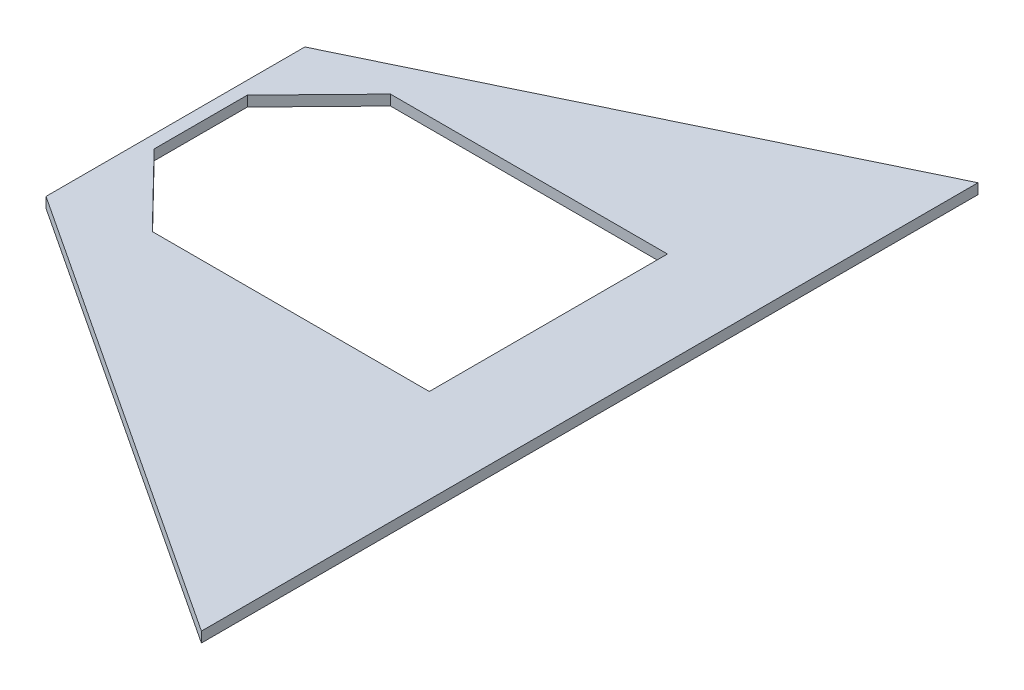
ISO-10303-21;
HEADER;
FILE_DESCRIPTION(('STEP AP214'),'2;1');
FILE_NAME('part.step','',(''),(''),'','','');
FILE_SCHEMA(('AUTOMOTIVE_DESIGN { 1 0 10303 214 1 1 1 1 }'));
ENDSEC;
DATA;
#1=APPLICATION_CONTEXT('core data for automotive mechanical design processes');
#2=APPLICATION_PROTOCOL_DEFINITION('international standard','automotive_design',2000,#1);
#3=PRODUCT_CONTEXT('',#1,'mechanical');
#4=PRODUCT('Part','Part','',(#3));
#5=PRODUCT_RELATED_PRODUCT_CATEGORY('part','',(#4));
#6=PRODUCT_DEFINITION_FORMATION('','',#4);
#7=PRODUCT_DEFINITION_CONTEXT('part definition',#1,'design');
#8=PRODUCT_DEFINITION('design','',#6,#7);
#9=PRODUCT_DEFINITION_SHAPE('','',#8);
#10=(LENGTH_UNIT() NAMED_UNIT(*) SI_UNIT(.MILLI.,.METRE.));
#11=(NAMED_UNIT(*) PLANE_ANGLE_UNIT() SI_UNIT($,.RADIAN.));
#12=(NAMED_UNIT(*) SI_UNIT($,.STERADIAN.) SOLID_ANGLE_UNIT());
#13=UNCERTAINTY_MEASURE_WITH_UNIT(LENGTH_MEASURE(1.E-05),#10,'distance_accuracy_value','');
#14=(GEOMETRIC_REPRESENTATION_CONTEXT(3) GLOBAL_UNCERTAINTY_ASSIGNED_CONTEXT((#13)) GLOBAL_UNIT_ASSIGNED_CONTEXT((#10,
#11,#12)) REPRESENTATION_CONTEXT('',''));
#15=CARTESIAN_POINT('',(0.,0.,0.));
#16=DIRECTION('',(0.,0.,1.));
#17=DIRECTION('',(1.,0.,0.));
#18=AXIS2_PLACEMENT_3D('',#15,#16,#17);
#19=CARTESIAN_POINT('',(0.,14.,0.));
#20=DIRECTION('',(0.,-1.,0.));
#21=DIRECTION('',(0.,0.,-1.));
#22=AXIS2_PLACEMENT_3D('',#19,#20,#21);
#23=PLANE('',#22);
#24=DIRECTION('',(0.698119237155006,0.,0.715981515623212));
#25=VECTOR('',#24,1.);
#26=CARTESIAN_POINT('',(-160.925569150778,14.,14.8388294913458));
#27=LINE('',#26,#25);
#28=CARTESIAN_POINT('',(-160.925569150778,14.,14.8388294913458));
#29=VERTEX_POINT('',#28);
#30=CARTESIAN_POINT('',(-133.624112040778,14.,42.8388294913458));
#31=VERTEX_POINT('',#30);
#32=EDGE_CURVE('E112',#29,#31,#27,.T.);
#33=ORIENTED_EDGE('',*,*,#32,.F.);
#34=DIRECTION('',(0.,0.,1.));
#35=VECTOR('',#34,1.);
#36=CARTESIAN_POINT('',(-160.925569150778,14.,-21.1611705086542));
#37=LINE('',#36,#35);
#38=CARTESIAN_POINT('',(-160.925569150778,14.,-21.1611705086542));
#39=VERTEX_POINT('',#38);
#40=EDGE_CURVE('E182',#39,#29,#37,.T.);
#41=ORIENTED_EDGE('',*,*,#40,.F.);
#42=DIRECTION('',(-0.698119237155006,0.,0.715981515623212));
#43=VECTOR('',#42,1.);
#44=CARTESIAN_POINT('',(-160.925569150778,14.,-21.1611705086542));
#45=LINE('',#44,#43);
#46=CARTESIAN_POINT('',(-133.624112040778,14.,-49.1611705086542));
#47=VERTEX_POINT('',#46);
#48=EDGE_CURVE('E168',#47,#39,#45,.T.);
#49=ORIENTED_EDGE('',*,*,#48,.F.);
#50=DIRECTION('',(-1.,0.,0.));
#51=VECTOR('',#50,1.);
#52=CARTESIAN_POINT('',(-133.624112040778,14.,-49.1611705086542));
#53=LINE('',#52,#51);
#54=CARTESIAN_POINT('',(-26.6241120407784,14.,-49.1611705086542));
#55=VERTEX_POINT('',#54);
#56=EDGE_CURVE('E154',#55,#47,#53,.T.);
#57=ORIENTED_EDGE('',*,*,#56,.F.);
#58=DIRECTION('',(0.,0.,-1.));
#59=VECTOR('',#58,1.);
#60=CARTESIAN_POINT('',(-26.6241120407784,14.,42.8388294913458));
#61=LINE('',#60,#59);
#62=CARTESIAN_POINT('',(-26.6241120407784,14.,42.8388294913458));
#63=VERTEX_POINT('',#62);
#64=EDGE_CURVE('E131',#63,#55,#61,.T.);
#65=ORIENTED_EDGE('',*,*,#64,.F.);
#66=DIRECTION('',(1.,0.,0.));
#67=VECTOR('',#66,1.);
#68=CARTESIAN_POINT('',(-133.624112040778,14.,42.8388294913458));
#69=LINE('',#68,#67);
#70=EDGE_CURVE('E123',#31,#63,#69,.T.);
#71=ORIENTED_EDGE('',*,*,#70,.F.);
#72=EDGE_LOOP('',(#33,#41,#49,#57,#65,#71));
#73=FACE_BOUND('',#72,.T.);
#74=DIRECTION('',(0.,0.,-1.));
#75=VECTOR('',#74,1.);
#76=CARTESIAN_POINT('',(-165.925569150778,14.,51.6057457720039));
#77=LINE('',#76,#75);
#78=CARTESIAN_POINT('',(-165.925569150778,14.,51.6057457720039));
#79=VERTEX_POINT('',#78);
#80=CARTESIAN_POINT('',(-165.925569150778,14.0000000000002,-48.3942542279961));
#81=VERTEX_POINT('',#80);
#82=EDGE_CURVE('E210',#79,#81,#77,.T.);
#83=ORIENTED_EDGE('',*,*,#82,.F.);
#84=DIRECTION('',(-0.835456479011976,0.,-0.549556613714104));
#85=VECTOR('',#84,1.);
#86=CARTESIAN_POINT('',(9.52029144173644,14.,167.012634651966));
#87=LINE('',#86,#85);
#88=CARTESIAN_POINT('',(9.52029144173644,14.,167.012634651966));
#89=VERTEX_POINT('',#88);
#90=EDGE_CURVE('E188',#89,#79,#87,.T.);
#91=ORIENTED_EDGE('',*,*,#90,.F.);
#92=DIRECTION('',(0.,0.,1.));
#93=VECTOR('',#92,1.);
#94=CARTESIAN_POINT('',(9.52029144173647,14.,-132.987365348034));
#95=LINE('',#94,#93);
#96=CARTESIAN_POINT('',(9.52029144173646,14.,-132.987365348034));
#97=VERTEX_POINT('',#96);
#98=EDGE_CURVE('E203',#97,#89,#95,.T.);
#99=ORIENTED_EDGE('',*,*,#98,.F.);
#100=DIRECTION('',(0.900762369356725,0.,-0.434312276997621));
#101=VECTOR('',#100,1.);
#102=CARTESIAN_POINT('',(-165.925569150778,14.0000000000002,-48.3942542279961));
#103=LINE('',#102,#101);
#104=EDGE_CURVE('E45',#81,#97,#103,.T.);
#105=ORIENTED_EDGE('',*,*,#104,.F.);
#106=EDGE_LOOP('',(#83,#91,#99,#105));
#107=FACE_BOUND('',#106,.T.);
#108=ADVANCED_FACE('F37',(#73,#107),#23,.F.);
#109=CARTESIAN_POINT('',(0.,10.,0.));
#110=DIRECTION('',(0.,-1.,0.));
#111=DIRECTION('',(0.,0.,-1.));
#112=AXIS2_PLACEMENT_3D('',#109,#110,#111);
#113=PLANE('',#112);
#114=DIRECTION('',(0.,0.,1.));
#115=VECTOR('',#114,1.);
#116=CARTESIAN_POINT('',(-160.925569150778,9.99999999999998,-21.1611705086542));
#117=LINE('',#116,#115);
#118=CARTESIAN_POINT('',(-160.925569150778,9.99999999999998,-21.1611705086542));
#119=VERTEX_POINT('',#118);
#120=CARTESIAN_POINT('',(-160.925569150778,9.99999999999998,14.8388294913458));
#121=VERTEX_POINT('',#120);
#122=EDGE_CURVE('E181',#119,#121,#117,.T.);
#123=ORIENTED_EDGE('',*,*,#122,.T.);
#124=DIRECTION('',(0.698119237155006,0.,0.715981515623212));
#125=VECTOR('',#124,1.);
#126=CARTESIAN_POINT('',(-160.925569150778,9.99999999999998,14.8388294913458));
#127=LINE('',#126,#125);
#128=CARTESIAN_POINT('',(-133.624112040778,10.,42.8388294913458));
#129=VERTEX_POINT('',#128);
#130=EDGE_CURVE('E117',#121,#129,#127,.T.);
#131=ORIENTED_EDGE('',*,*,#130,.T.);
#132=DIRECTION('',(1.,0.,0.));
#133=VECTOR('',#132,1.);
#134=CARTESIAN_POINT('',(-133.624112040778,9.99999999999998,42.8388294913458));
#135=LINE('',#134,#133);
#136=CARTESIAN_POINT('',(-26.6241120407784,9.99999999999998,42.8388294913458));
#137=VERTEX_POINT('',#136);
#138=EDGE_CURVE('E118',#129,#137,#135,.T.);
#139=ORIENTED_EDGE('',*,*,#138,.T.);
#140=DIRECTION('',(0.,0.,-1.));
#141=VECTOR('',#140,1.);
#142=CARTESIAN_POINT('',(-26.6241120407784,9.99999999999998,42.8388294913458));
#143=LINE('',#142,#141);
#144=CARTESIAN_POINT('',(-26.6241120407784,9.99999999999998,-49.1611705086542));
#145=VERTEX_POINT('',#144);
#146=EDGE_CURVE('E132',#137,#145,#143,.T.);
#147=ORIENTED_EDGE('',*,*,#146,.T.);
#148=DIRECTION('',(-1.,0.,0.));
#149=VECTOR('',#148,1.);
#150=CARTESIAN_POINT('',(-133.624112040778,9.99999999999998,-49.1611705086542));
#151=LINE('',#150,#149);
#152=CARTESIAN_POINT('',(-133.624112040778,9.99999999999998,-49.1611705086542));
#153=VERTEX_POINT('',#152);
#154=EDGE_CURVE('E148',#145,#153,#151,.T.);
#155=ORIENTED_EDGE('',*,*,#154,.T.);
#156=DIRECTION('',(-0.698119237155006,0.,0.715981515623212));
#157=VECTOR('',#156,1.);
#158=CARTESIAN_POINT('',(-160.925569150778,9.99999999999998,-21.1611705086542));
#159=LINE('',#158,#157);
#160=EDGE_CURVE('E162',#153,#119,#159,.T.);
#161=ORIENTED_EDGE('',*,*,#160,.T.);
#162=EDGE_LOOP('',(#123,#131,#139,#147,#155,#161));
#163=FACE_BOUND('',#162,.T.);
#164=DIRECTION('',(0.,0.,-1.));
#165=VECTOR('',#164,1.);
#166=CARTESIAN_POINT('',(-165.925569150778,10.,51.6057457720039));
#167=LINE('',#166,#165);
#168=CARTESIAN_POINT('',(-165.925569150778,10.,51.6057457720039));
#169=VERTEX_POINT('',#168);
#170=CARTESIAN_POINT('',(-165.925569150778,10.0000000000002,-48.3942542279961));
#171=VERTEX_POINT('',#170);
#172=EDGE_CURVE('E189',#169,#171,#167,.T.);
#173=ORIENTED_EDGE('',*,*,#172,.T.);
#174=DIRECTION('',(0.900762369356725,0.,-0.434312276997621));
#175=VECTOR('',#174,1.);
#176=CARTESIAN_POINT('',(-165.925569150778,10.0000000000002,-48.3942542279961));
#177=LINE('',#176,#175);
#178=CARTESIAN_POINT('',(9.52029144173646,10.,-132.987365348034));
#179=VERTEX_POINT('',#178);
#180=EDGE_CURVE('E12',#171,#179,#177,.T.);
#181=ORIENTED_EDGE('',*,*,#180,.T.);
#182=DIRECTION('',(0.,0.,1.));
#183=VECTOR('',#182,1.);
#184=CARTESIAN_POINT('',(9.52029144173647,10.,-132.987365348034));
#185=LINE('',#184,#183);
#186=CARTESIAN_POINT('',(9.52029144173644,10.,167.012634651966));
#187=VERTEX_POINT('',#186);
#188=EDGE_CURVE('E202',#179,#187,#185,.T.);
#189=ORIENTED_EDGE('',*,*,#188,.T.);
#190=DIRECTION('',(-0.835456479011976,0.,-0.549556613714104));
#191=VECTOR('',#190,1.);
#192=CARTESIAN_POINT('',(9.52029144173644,10.,167.012634651966));
#193=LINE('',#192,#191);
#194=EDGE_CURVE('E218',#187,#169,#193,.T.);
#195=ORIENTED_EDGE('',*,*,#194,.T.);
#196=EDGE_LOOP('',(#173,#181,#189,#195));
#197=FACE_BOUND('',#196,.T.);
#198=ADVANCED_FACE('F249',(#163,#197),#113,.T.);
#199=CARTESIAN_POINT('',(-165.925569150778,10.,51.6057457720039));
#200=DIRECTION('',(1.,0.,0.));
#201=DIRECTION('',(0.,0.,-1.));
#202=AXIS2_PLACEMENT_3D('',#199,#200,#201);
#203=PLANE('',#202);
#204=ORIENTED_EDGE('',*,*,#82,.T.);
#205=DIRECTION('',(0.,1.,0.));
#206=VECTOR('',#205,1.);
#207=CARTESIAN_POINT('',(-165.925569150778,10.0000000000002,-48.3942542279961));
#208=LINE('',#207,#206);
#209=EDGE_CURVE('E185',#171,#81,#208,.T.);
#210=ORIENTED_EDGE('',*,*,#209,.F.);
#211=ORIENTED_EDGE('',*,*,#172,.F.);
#212=DIRECTION('',(0.,1.,0.));
#213=VECTOR('',#212,1.);
#214=CARTESIAN_POINT('',(-165.925569150778,10.,51.6057457720039));
#215=LINE('',#214,#213);
#216=EDGE_CURVE('E194',#169,#79,#215,.T.);
#217=ORIENTED_EDGE('',*,*,#216,.T.);
#218=EDGE_LOOP('',(#204,#210,#211,#217));
#219=FACE_BOUND('',#218,.T.);
#220=ADVANCED_FACE('F236',(#219),#203,.F.);
#221=CARTESIAN_POINT('',(9.52029144173644,10.,167.012634651966));
#222=DIRECTION('',(0.549556613714104,0.,-0.835456479011976));
#223=DIRECTION('',(-0.835456479011976,0.,-0.549556613714104));
#224=AXIS2_PLACEMENT_3D('',#221,#222,#223);
#225=PLANE('',#224);
#226=ORIENTED_EDGE('',*,*,#90,.T.);
#227=ORIENTED_EDGE('',*,*,#216,.F.);
#228=ORIENTED_EDGE('',*,*,#194,.F.);
#229=DIRECTION('',(0.,1.,0.));
#230=VECTOR('',#229,1.);
#231=CARTESIAN_POINT('',(9.52029144173644,10.,167.012634651966));
#232=LINE('',#231,#230);
#233=EDGE_CURVE('E221',#187,#89,#232,.T.);
#234=ORIENTED_EDGE('',*,*,#233,.T.);
#235=EDGE_LOOP('',(#226,#227,#228,#234));
#236=FACE_BOUND('',#235,.T.);
#237=ADVANCED_FACE('F250',(#236),#225,.F.);
#238=CARTESIAN_POINT('',(9.52029144173647,10.,-132.987365348034));
#239=DIRECTION('',(-1.,0.,0.));
#240=DIRECTION('',(0.,0.,1.));
#241=AXIS2_PLACEMENT_3D('',#238,#239,#240);
#242=PLANE('',#241);
#243=ORIENTED_EDGE('',*,*,#98,.T.);
#244=ORIENTED_EDGE('',*,*,#233,.F.);
#245=ORIENTED_EDGE('',*,*,#188,.F.);
#246=DIRECTION('',(0.,1.,0.));
#247=VECTOR('',#246,1.);
#248=CARTESIAN_POINT('',(9.52029144173647,10.,-132.987365348034));
#249=LINE('',#248,#247);
#250=EDGE_CURVE('E199',#179,#97,#249,.T.);
#251=ORIENTED_EDGE('',*,*,#250,.T.);
#252=EDGE_LOOP('',(#243,#244,#245,#251));
#253=FACE_BOUND('',#252,.T.);
#254=ADVANCED_FACE('F246',(#253),#242,.F.);
#255=CARTESIAN_POINT('',(-165.925569150778,10.0000000000002,-48.3942542279961));
#256=DIRECTION('',(0.434312276997621,0.,0.900762369356725));
#257=DIRECTION('',(0.900762369356725,0.,-0.434312276997621));
#258=AXIS2_PLACEMENT_3D('',#255,#256,#257);
#259=PLANE('',#258);
#260=ORIENTED_EDGE('',*,*,#104,.T.);
#261=ORIENTED_EDGE('',*,*,#250,.F.);
#262=ORIENTED_EDGE('',*,*,#180,.F.);
#263=ORIENTED_EDGE('',*,*,#209,.T.);
#264=EDGE_LOOP('',(#260,#261,#262,#263));
#265=FACE_BOUND('',#264,.T.);
#266=ADVANCED_FACE('F244',(#265),#259,.F.);
#267=CARTESIAN_POINT('',(-160.925569150778,9.99999999999998,-21.1611705086542));
#268=DIRECTION('',(-1.,0.,0.));
#269=DIRECTION('',(0.,0.,1.));
#270=AXIS2_PLACEMENT_3D('',#267,#268,#269);
#271=PLANE('',#270);
#272=ORIENTED_EDGE('',*,*,#40,.T.);
#273=DIRECTION('',(0.,1.,0.));
#274=VECTOR('',#273,1.);
#275=CARTESIAN_POINT('',(-160.925569150778,9.99999999999998,14.8388294913458));
#276=LINE('',#275,#274);
#277=EDGE_CURVE('E53',#121,#29,#276,.T.);
#278=ORIENTED_EDGE('',*,*,#277,.F.);
#279=ORIENTED_EDGE('',*,*,#122,.F.);
#280=DIRECTION('',(0.,1.,0.));
#281=VECTOR('',#280,1.);
#282=CARTESIAN_POINT('',(-160.925569150778,9.99999999999998,-21.1611705086542));
#283=LINE('',#282,#281);
#284=EDGE_CURVE('E178',#119,#39,#283,.T.);
#285=ORIENTED_EDGE('',*,*,#284,.T.);
#286=EDGE_LOOP('',(#272,#278,#279,#285));
#287=FACE_BOUND('',#286,.T.);
#288=ADVANCED_FACE('F260',(#287),#271,.F.);
#289=CARTESIAN_POINT('',(-160.925569150778,9.99999999999998,-21.1611705086542));
#290=DIRECTION('',(-0.715981515623212,0.,-0.698119237155006));
#291=DIRECTION('',(-0.698119237155006,0.,0.715981515623212));
#292=AXIS2_PLACEMENT_3D('',#289,#290,#291);
#293=PLANE('',#292);
#294=ORIENTED_EDGE('',*,*,#48,.T.);
#295=ORIENTED_EDGE('',*,*,#284,.F.);
#296=ORIENTED_EDGE('',*,*,#160,.F.);
#297=DIRECTION('',(0.,1.,0.));
#298=VECTOR('',#297,1.);
#299=CARTESIAN_POINT('',(-133.624112040778,9.99999999999998,-49.1611705086542));
#300=LINE('',#299,#298);
#301=EDGE_CURVE('E165',#153,#47,#300,.T.);
#302=ORIENTED_EDGE('',*,*,#301,.T.);
#303=EDGE_LOOP('',(#294,#295,#296,#302));
#304=FACE_BOUND('',#303,.T.);
#305=ADVANCED_FACE('F265',(#304),#293,.F.);
#306=CARTESIAN_POINT('',(-133.624112040778,9.99999999999998,-49.1611705086542));
#307=DIRECTION('',(0.,0.,-1.));
#308=DIRECTION('',(-1.,0.,0.));
#309=AXIS2_PLACEMENT_3D('',#306,#307,#308);
#310=PLANE('',#309);
#311=ORIENTED_EDGE('',*,*,#56,.T.);
#312=ORIENTED_EDGE('',*,*,#301,.F.);
#313=ORIENTED_EDGE('',*,*,#154,.F.);
#314=DIRECTION('',(0.,1.,0.));
#315=VECTOR('',#314,1.);
#316=CARTESIAN_POINT('',(-26.6241120407784,9.99999999999998,-49.1611705086542));
#317=LINE('',#316,#315);
#318=EDGE_CURVE('E151',#145,#55,#317,.T.);
#319=ORIENTED_EDGE('',*,*,#318,.T.);
#320=EDGE_LOOP('',(#311,#312,#313,#319));
#321=FACE_BOUND('',#320,.T.);
#322=ADVANCED_FACE('F296',(#321),#310,.F.);
#323=CARTESIAN_POINT('',(-26.6241120407784,9.99999999999998,42.8388294913458));
#324=DIRECTION('',(1.,0.,0.));
#325=DIRECTION('',(0.,0.,-1.));
#326=AXIS2_PLACEMENT_3D('',#323,#324,#325);
#327=PLANE('',#326);
#328=ORIENTED_EDGE('',*,*,#64,.T.);
#329=ORIENTED_EDGE('',*,*,#318,.F.);
#330=ORIENTED_EDGE('',*,*,#146,.F.);
#331=DIRECTION('',(0.,1.,0.));
#332=VECTOR('',#331,1.);
#333=CARTESIAN_POINT('',(-26.6241120407784,9.99999999999998,42.8388294913458));
#334=LINE('',#333,#332);
#335=EDGE_CURVE('E135',#137,#63,#334,.T.);
#336=ORIENTED_EDGE('',*,*,#335,.T.);
#337=EDGE_LOOP('',(#328,#329,#330,#336));
#338=FACE_BOUND('',#337,.T.);
#339=ADVANCED_FACE('F299',(#338),#327,.F.);
#340=CARTESIAN_POINT('',(-133.624112040778,9.99999999999998,42.8388294913458));
#341=DIRECTION('',(0.,0.,1.));
#342=DIRECTION('',(1.,0.,0.));
#343=AXIS2_PLACEMENT_3D('',#340,#341,#342);
#344=PLANE('',#343);
#345=ORIENTED_EDGE('',*,*,#70,.T.);
#346=ORIENTED_EDGE('',*,*,#335,.F.);
#347=ORIENTED_EDGE('',*,*,#138,.F.);
#348=DIRECTION('',(0.,1.,0.));
#349=VECTOR('',#348,1.);
#350=CARTESIAN_POINT('',(-133.624112040778,9.99999999999998,42.8388294913458));
#351=LINE('',#350,#349);
#352=EDGE_CURVE('E58',#129,#31,#351,.T.);
#353=ORIENTED_EDGE('',*,*,#352,.T.);
#354=EDGE_LOOP('',(#345,#346,#347,#353));
#355=FACE_BOUND('',#354,.T.);
#356=ADVANCED_FACE('F121',(#355),#344,.F.);
#357=CARTESIAN_POINT('',(-160.925569150778,9.99999999999998,14.8388294913458));
#358=DIRECTION('',(-0.715981515623212,0.,0.698119237155006));
#359=DIRECTION('',(0.698119237155006,0.,0.715981515623212));
#360=AXIS2_PLACEMENT_3D('',#357,#358,#359);
#361=PLANE('',#360);
#362=ORIENTED_EDGE('',*,*,#32,.T.);
#363=ORIENTED_EDGE('',*,*,#352,.F.);
#364=ORIENTED_EDGE('',*,*,#130,.F.);
#365=ORIENTED_EDGE('',*,*,#277,.T.);
#366=EDGE_LOOP('',(#362,#363,#364,#365));
#367=FACE_BOUND('',#366,.T.);
#368=ADVANCED_FACE('F113',(#367),#361,.F.);
#369=CLOSED_SHELL('',(#108,#198,#220,#237,#254,#266,#288,#305,#322,#339,#356,#368));
#370=MANIFOLD_SOLID_BREP('B2',#369);
#371=ADVANCED_BREP_SHAPE_REPRESENTATION('',(#18,#370),#14);
#372=SHAPE_DEFINITION_REPRESENTATION(#9,#371);
ENDSEC;
END-ISO-10303-21;
